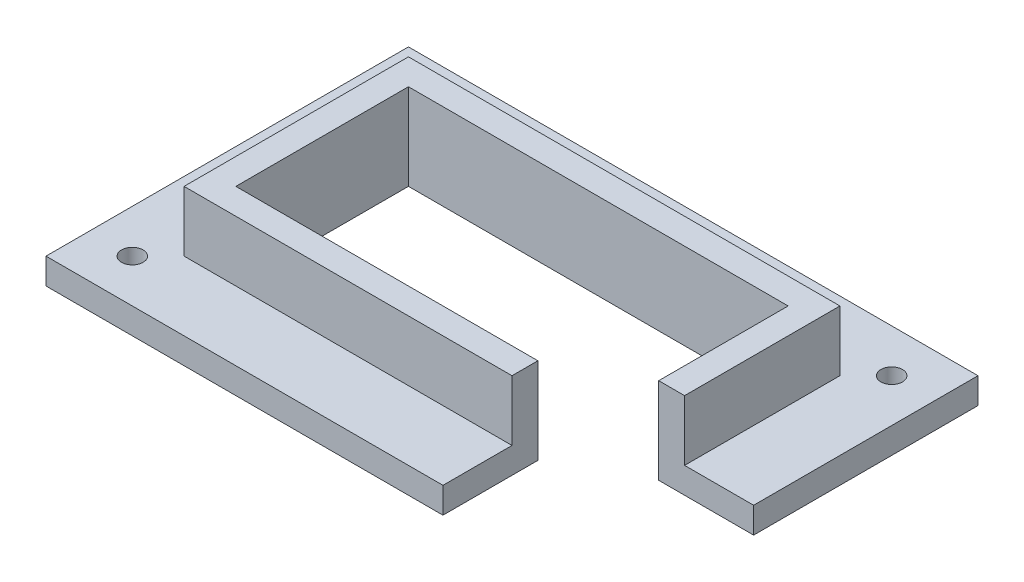
ISO-10303-21;
HEADER;
FILE_DESCRIPTION(('STEP AP214'),'2;1');
FILE_NAME('part.step','',(''),(''),'','','');
FILE_SCHEMA(('AUTOMOTIVE_DESIGN { 1 0 10303 214 1 1 1 1 }'));
ENDSEC;
DATA;
#1=APPLICATION_CONTEXT('core data for automotive mechanical design processes');
#2=APPLICATION_PROTOCOL_DEFINITION('international standard','automotive_design',2000,#1);
#3=PRODUCT_CONTEXT('',#1,'mechanical');
#4=PRODUCT('Part','Part','',(#3));
#5=PRODUCT_RELATED_PRODUCT_CATEGORY('part','',(#4));
#6=PRODUCT_DEFINITION_FORMATION('','',#4);
#7=PRODUCT_DEFINITION_CONTEXT('part definition',#1,'design');
#8=PRODUCT_DEFINITION('design','',#6,#7);
#9=PRODUCT_DEFINITION_SHAPE('','',#8);
#10=(LENGTH_UNIT() NAMED_UNIT(*) SI_UNIT(.MILLI.,.METRE.));
#11=(NAMED_UNIT(*) PLANE_ANGLE_UNIT() SI_UNIT($,.RADIAN.));
#12=(NAMED_UNIT(*) SI_UNIT($,.STERADIAN.) SOLID_ANGLE_UNIT());
#13=UNCERTAINTY_MEASURE_WITH_UNIT(LENGTH_MEASURE(1.E-05),#10,'distance_accuracy_value','');
#14=(GEOMETRIC_REPRESENTATION_CONTEXT(3) GLOBAL_UNCERTAINTY_ASSIGNED_CONTEXT((#13)) GLOBAL_UNIT_ASSIGNED_CONTEXT((#10,
#11,#12)) REPRESENTATION_CONTEXT('',''));
#15=CARTESIAN_POINT('',(0.,0.,0.));
#16=DIRECTION('',(0.,0.,1.));
#17=DIRECTION('',(1.,0.,0.));
#18=AXIS2_PLACEMENT_3D('',#15,#16,#17);
#19=CARTESIAN_POINT('',(0.,3.,0.));
#20=DIRECTION('',(0.,-1.,0.));
#21=DIRECTION('',(0.,0.,-1.));
#22=AXIS2_PLACEMENT_3D('',#19,#20,#21);
#23=PLANE('',#22);
#24=CARTESIAN_POINT('',(-28.,3.,16.));
#25=DIRECTION('',(0.,1.,0.));
#26=DIRECTION('',(0.,0.,1.));
#27=AXIS2_PLACEMENT_3D('',#24,#25,#26);
#28=CIRCLE('',#27,1.25);
#29=CARTESIAN_POINT('',(-28.,3.,17.25));
#30=VERTEX_POINT('',#29);
#31=EDGE_CURVE('E494',#30,#30,#28,.T.);
#32=ORIENTED_EDGE('',*,*,#31,.F.);
#33=EDGE_LOOP('',(#32));
#34=FACE_BOUND('',#33,.T.);
#35=CARTESIAN_POINT('',(-28.,3.,-16.));
#36=DIRECTION('',(0.,1.,0.));
#37=DIRECTION('',(0.,0.,1.));
#38=AXIS2_PLACEMENT_3D('',#35,#36,#37);
#39=CIRCLE('',#38,1.25);
#40=CARTESIAN_POINT('',(-28.,3.,-14.75));
#41=VERTEX_POINT('',#40);
#42=EDGE_CURVE('E501',#41,#41,#39,.T.);
#43=ORIENTED_EDGE('',*,*,#42,.F.);
#44=EDGE_LOOP('',(#43));
#45=FACE_BOUND('',#44,.T.);
#46=CARTESIAN_POINT('',(28.,3.,-16.));
#47=DIRECTION('',(0.,1.,0.));
#48=DIRECTION('',(0.,0.,1.));
#49=AXIS2_PLACEMENT_3D('',#46,#47,#48);
#50=CIRCLE('',#49,1.25);
#51=CARTESIAN_POINT('',(28.,3.,-14.75));
#52=VERTEX_POINT('',#51);
#53=EDGE_CURVE('E505',#52,#52,#50,.T.);
#54=ORIENTED_EDGE('',*,*,#53,.F.);
#55=EDGE_LOOP('',(#54));
#56=FACE_BOUND('',#55,.T.);
#57=DIRECTION('',(1.,0.,0.));
#58=VECTOR('',#57,1.);
#59=CARTESIAN_POINT('',(13.,3.,13.));
#60=LINE('',#59,#58);
#61=CARTESIAN_POINT('',(-25.,3.,13.));
#62=VERTEX_POINT('',#61);
#63=CARTESIAN_POINT('',(13.,3.,13.));
#64=VERTEX_POINT('',#63);
#65=EDGE_CURVE('E48',#62,#64,#60,.T.);
#66=ORIENTED_EDGE('',*,*,#65,.F.);
#67=DIRECTION('',(0.,0.,1.));
#68=VECTOR('',#67,1.);
#69=CARTESIAN_POINT('',(-25.,3.,13.));
#70=LINE('',#69,#68);
#71=CARTESIAN_POINT('',(-25.,3.,-13.));
#72=VERTEX_POINT('',#71);
#73=EDGE_CURVE('E52',#72,#62,#70,.T.);
#74=ORIENTED_EDGE('',*,*,#73,.F.);
#75=DIRECTION('',(-1.,0.,0.));
#76=VECTOR('',#75,1.);
#77=CARTESIAN_POINT('',(-25.,3.,-13.));
#78=LINE('',#77,#76);
#79=CARTESIAN_POINT('',(25.,3.,-13.));
#80=VERTEX_POINT('',#79);
#81=EDGE_CURVE('E189',#80,#72,#78,.T.);
#82=ORIENTED_EDGE('',*,*,#81,.F.);
#83=DIRECTION('',(0.,0.,-1.));
#84=VECTOR('',#83,1.);
#85=CARTESIAN_POINT('',(25.,3.,-13.));
#86=LINE('',#85,#84);
#87=CARTESIAN_POINT('',(25.,3.,5.));
#88=VERTEX_POINT('',#87);
#89=EDGE_CURVE('E186',#88,#80,#86,.T.);
#90=ORIENTED_EDGE('',*,*,#89,.F.);
#91=DIRECTION('',(1.,0.,0.));
#92=VECTOR('',#91,1.);
#93=CARTESIAN_POINT('',(22.,3.,5.));
#94=LINE('',#93,#92);
#95=CARTESIAN_POINT('',(33.,3.,4.99999999999999));
#96=VERTEX_POINT('',#95);
#97=EDGE_CURVE('E220',#88,#96,#94,.T.);
#98=ORIENTED_EDGE('',*,*,#97,.T.);
#99=DIRECTION('',(0.,0.,-1.));
#100=VECTOR('',#99,1.);
#101=CARTESIAN_POINT('',(33.,3.,4.99999999999999));
#102=LINE('',#101,#100);
#103=CARTESIAN_POINT('',(33.,3.,-21.));
#104=VERTEX_POINT('',#103);
#105=EDGE_CURVE('E208',#96,#104,#102,.T.);
#106=ORIENTED_EDGE('',*,*,#105,.T.);
#107=DIRECTION('',(-1.,0.,0.));
#108=VECTOR('',#107,1.);
#109=CARTESIAN_POINT('',(-33.,3.,-21.));
#110=LINE('',#109,#108);
#111=CARTESIAN_POINT('',(-33.,3.,-21.));
#112=VERTEX_POINT('',#111);
#113=EDGE_CURVE('E211',#104,#112,#110,.T.);
#114=ORIENTED_EDGE('',*,*,#113,.T.);
#115=DIRECTION('',(0.,0.,1.));
#116=VECTOR('',#115,1.);
#117=CARTESIAN_POINT('',(-33.,3.,21.));
#118=LINE('',#117,#116);
#119=CARTESIAN_POINT('',(-33.,3.,21.));
#120=VERTEX_POINT('',#119);
#121=EDGE_CURVE('E214',#112,#120,#118,.T.);
#122=ORIENTED_EDGE('',*,*,#121,.T.);
#123=DIRECTION('',(1.,0.,0.));
#124=VECTOR('',#123,1.);
#125=CARTESIAN_POINT('',(-33.,3.,21.));
#126=LINE('',#125,#124);
#127=CARTESIAN_POINT('',(13.,3.,21.));
#128=VERTEX_POINT('',#127);
#129=EDGE_CURVE('E216',#120,#128,#126,.T.);
#130=ORIENTED_EDGE('',*,*,#129,.T.);
#131=DIRECTION('',(0.,0.,-1.));
#132=VECTOR('',#131,1.);
#133=CARTESIAN_POINT('',(13.,3.,9.99999999999999));
#134=LINE('',#133,#132);
#135=EDGE_CURVE('E218',#128,#64,#134,.T.);
#136=ORIENTED_EDGE('',*,*,#135,.T.);
#137=EDGE_LOOP('',(#66,#74,#82,#90,#98,#106,#114,#122,#130,#136));
#138=FACE_BOUND('',#137,.T.);
#139=ADVANCED_FACE('F33',(#34,#45,#56,#138),#23,.F.);
#140=CARTESIAN_POINT('',(33.,3.,4.99999999999999));
#141=DIRECTION('',(-1.,0.,0.));
#142=DIRECTION('',(0.,0.,1.));
#143=AXIS2_PLACEMENT_3D('',#140,#141,#142);
#144=PLANE('',#143);
#145=DIRECTION('',(0.,0.,-1.));
#146=VECTOR('',#145,1.);
#147=CARTESIAN_POINT('',(33.,0.,4.99999999999999));
#148=LINE('',#147,#146);
#149=CARTESIAN_POINT('',(33.,0.,4.99999999999999));
#150=VERTEX_POINT('',#149);
#151=CARTESIAN_POINT('',(33.,0.,-21.));
#152=VERTEX_POINT('',#151);
#153=EDGE_CURVE('E207',#150,#152,#148,.T.);
#154=ORIENTED_EDGE('',*,*,#153,.T.);
#155=DIRECTION('',(0.,-1.,0.));
#156=VECTOR('',#155,1.);
#157=CARTESIAN_POINT('',(33.,3.,-21.));
#158=LINE('',#157,#156);
#159=EDGE_CURVE('E11',#104,#152,#158,.T.);
#160=ORIENTED_EDGE('',*,*,#159,.F.);
#161=ORIENTED_EDGE('',*,*,#105,.F.);
#162=DIRECTION('',(0.,-1.,0.));
#163=VECTOR('',#162,1.);
#164=CARTESIAN_POINT('',(33.,3.,4.99999999999999));
#165=LINE('',#164,#163);
#166=EDGE_CURVE('E222',#96,#150,#165,.T.);
#167=ORIENTED_EDGE('',*,*,#166,.T.);
#168=EDGE_LOOP('',(#154,#160,#161,#167));
#169=FACE_BOUND('',#168,.T.);
#170=ADVANCED_FACE('F35',(#169),#144,.F.);
#171=CARTESIAN_POINT('',(-33.,3.,-21.));
#172=DIRECTION('',(0.,0.,1.));
#173=DIRECTION('',(1.,0.,0.));
#174=AXIS2_PLACEMENT_3D('',#171,#172,#173);
#175=PLANE('',#174);
#176=DIRECTION('',(-1.,0.,0.));
#177=VECTOR('',#176,1.);
#178=CARTESIAN_POINT('',(-33.,0.,-21.));
#179=LINE('',#178,#177);
#180=CARTESIAN_POINT('',(-33.,0.,-21.));
#181=VERTEX_POINT('',#180);
#182=EDGE_CURVE('E225',#152,#181,#179,.T.);
#183=ORIENTED_EDGE('',*,*,#182,.T.);
#184=DIRECTION('',(0.,-1.,0.));
#185=VECTOR('',#184,1.);
#186=CARTESIAN_POINT('',(-33.,3.,-21.));
#187=LINE('',#186,#185);
#188=EDGE_CURVE('E41',#112,#181,#187,.T.);
#189=ORIENTED_EDGE('',*,*,#188,.F.);
#190=ORIENTED_EDGE('',*,*,#113,.F.);
#191=ORIENTED_EDGE('',*,*,#159,.T.);
#192=EDGE_LOOP('',(#183,#189,#190,#191));
#193=FACE_BOUND('',#192,.T.);
#194=ADVANCED_FACE('F301',(#193),#175,.F.);
#195=CARTESIAN_POINT('',(-33.,3.,21.));
#196=DIRECTION('',(1.,0.,0.));
#197=DIRECTION('',(0.,0.,-1.));
#198=AXIS2_PLACEMENT_3D('',#195,#196,#197);
#199=PLANE('',#198);
#200=DIRECTION('',(0.,0.,1.));
#201=VECTOR('',#200,1.);
#202=CARTESIAN_POINT('',(-33.,0.,21.));
#203=LINE('',#202,#201);
#204=CARTESIAN_POINT('',(-33.,0.,21.));
#205=VERTEX_POINT('',#204);
#206=EDGE_CURVE('E227',#181,#205,#203,.T.);
#207=ORIENTED_EDGE('',*,*,#206,.T.);
#208=DIRECTION('',(0.,-1.,0.));
#209=VECTOR('',#208,1.);
#210=CARTESIAN_POINT('',(-33.,3.,21.));
#211=LINE('',#210,#209);
#212=EDGE_CURVE('E254',#120,#205,#211,.T.);
#213=ORIENTED_EDGE('',*,*,#212,.F.);
#214=ORIENTED_EDGE('',*,*,#121,.F.);
#215=ORIENTED_EDGE('',*,*,#188,.T.);
#216=EDGE_LOOP('',(#207,#213,#214,#215));
#217=FACE_BOUND('',#216,.T.);
#218=ADVANCED_FACE('F261',(#217),#199,.F.);
#219=CARTESIAN_POINT('',(-33.,3.,21.));
#220=DIRECTION('',(0.,0.,-1.));
#221=DIRECTION('',(-1.,0.,0.));
#222=AXIS2_PLACEMENT_3D('',#219,#220,#221);
#223=PLANE('',#222);
#224=DIRECTION('',(1.,0.,0.));
#225=VECTOR('',#224,1.);
#226=CARTESIAN_POINT('',(-33.,0.,21.));
#227=LINE('',#226,#225);
#228=CARTESIAN_POINT('',(13.,0.,21.));
#229=VERTEX_POINT('',#228);
#230=EDGE_CURVE('E229',#205,#229,#227,.T.);
#231=ORIENTED_EDGE('',*,*,#230,.T.);
#232=DIRECTION('',(0.,-1.,0.));
#233=VECTOR('',#232,1.);
#234=CARTESIAN_POINT('',(13.,3.,21.));
#235=LINE('',#234,#233);
#236=EDGE_CURVE('E251',#128,#229,#235,.T.);
#237=ORIENTED_EDGE('',*,*,#236,.F.);
#238=ORIENTED_EDGE('',*,*,#129,.F.);
#239=ORIENTED_EDGE('',*,*,#212,.T.);
#240=EDGE_LOOP('',(#231,#237,#238,#239));
#241=FACE_BOUND('',#240,.T.);
#242=ADVANCED_FACE('F271',(#241),#223,.F.);
#243=CARTESIAN_POINT('',(13.,3.,9.99999999999999));
#244=DIRECTION('',(-1.,0.,0.));
#245=DIRECTION('',(0.,0.,1.));
#246=AXIS2_PLACEMENT_3D('',#243,#244,#245);
#247=PLANE('',#246);
#248=DIRECTION('',(0.,0.,-1.));
#249=VECTOR('',#248,1.);
#250=CARTESIAN_POINT('',(13.,0.,9.99999999999999));
#251=LINE('',#250,#249);
#252=CARTESIAN_POINT('',(13.,0.,9.99999999999999));
#253=VERTEX_POINT('',#252);
#254=EDGE_CURVE('E231',#229,#253,#251,.T.);
#255=ORIENTED_EDGE('',*,*,#254,.T.);
#256=DIRECTION('',(0.,-1.,0.));
#257=VECTOR('',#256,1.);
#258=CARTESIAN_POINT('',(13.,3.,9.99999999999999));
#259=LINE('',#258,#257);
#260=CARTESIAN_POINT('',(13.,10.,9.99999999999999));
#261=VERTEX_POINT('',#260);
#262=EDGE_CURVE('E148',#261,#253,#259,.T.);
#263=ORIENTED_EDGE('',*,*,#262,.F.);
#264=DIRECTION('',(0.,0.,-1.));
#265=VECTOR('',#264,1.);
#266=CARTESIAN_POINT('',(13.,10.,9.99999999999999));
#267=LINE('',#266,#265);
#268=CARTESIAN_POINT('',(13.,10.,13.));
#269=VERTEX_POINT('',#268);
#270=EDGE_CURVE('E163',#269,#261,#267,.T.);
#271=ORIENTED_EDGE('',*,*,#270,.F.);
#272=DIRECTION('',(0.,-1.,0.));
#273=VECTOR('',#272,1.);
#274=CARTESIAN_POINT('',(13.,10.,13.));
#275=LINE('',#274,#273);
#276=EDGE_CURVE('E185',#269,#64,#275,.T.);
#277=ORIENTED_EDGE('',*,*,#276,.T.);
#278=ORIENTED_EDGE('',*,*,#135,.F.);
#279=ORIENTED_EDGE('',*,*,#236,.T.);
#280=EDGE_LOOP('',(#255,#263,#271,#277,#278,#279));
#281=FACE_BOUND('',#280,.T.);
#282=ADVANCED_FACE('F275',(#281),#247,.F.);
#283=CARTESIAN_POINT('',(-22.,3.,9.99999999999999));
#284=DIRECTION('',(0.,0.,1.));
#285=DIRECTION('',(1.,0.,0.));
#286=AXIS2_PLACEMENT_3D('',#283,#284,#285);
#287=PLANE('',#286);
#288=DIRECTION('',(-1.,0.,0.));
#289=VECTOR('',#288,1.);
#290=CARTESIAN_POINT('',(-22.,0.,9.99999999999999));
#291=LINE('',#290,#289);
#292=CARTESIAN_POINT('',(-22.,0.,9.99999999999999));
#293=VERTEX_POINT('',#292);
#294=EDGE_CURVE('E145',#253,#293,#291,.T.);
#295=ORIENTED_EDGE('',*,*,#294,.T.);
#296=DIRECTION('',(0.,-1.,0.));
#297=VECTOR('',#296,1.);
#298=CARTESIAN_POINT('',(-22.,3.,9.99999999999999));
#299=LINE('',#298,#297);
#300=CARTESIAN_POINT('',(-22.,10.,9.99999999999999));
#301=VERTEX_POINT('',#300);
#302=EDGE_CURVE('E138',#301,#293,#299,.T.);
#303=ORIENTED_EDGE('',*,*,#302,.F.);
#304=DIRECTION('',(-1.,0.,0.));
#305=VECTOR('',#304,1.);
#306=CARTESIAN_POINT('',(-22.,10.,9.99999999999999));
#307=LINE('',#306,#305);
#308=EDGE_CURVE('E143',#261,#301,#307,.T.);
#309=ORIENTED_EDGE('',*,*,#308,.F.);
#310=ORIENTED_EDGE('',*,*,#262,.T.);
#311=EDGE_LOOP('',(#295,#303,#309,#310));
#312=FACE_BOUND('',#311,.T.);
#313=ADVANCED_FACE('F140',(#312),#287,.F.);
#314=CARTESIAN_POINT('',(-22.,3.,9.99999999999999));
#315=DIRECTION('',(-1.,0.,0.));
#316=DIRECTION('',(0.,0.,1.));
#317=AXIS2_PLACEMENT_3D('',#314,#315,#316);
#318=PLANE('',#317);
#319=DIRECTION('',(0.,0.,-1.));
#320=VECTOR('',#319,1.);
#321=CARTESIAN_POINT('',(-22.,0.,9.99999999999999));
#322=LINE('',#321,#320);
#323=CARTESIAN_POINT('',(-22.,0.,-10.));
#324=VERTEX_POINT('',#323);
#325=EDGE_CURVE('E234',#293,#324,#322,.T.);
#326=ORIENTED_EDGE('',*,*,#325,.T.);
#327=DIRECTION('',(0.,-1.,0.));
#328=VECTOR('',#327,1.);
#329=CARTESIAN_POINT('',(-22.,3.,-10.));
#330=LINE('',#329,#328);
#331=CARTESIAN_POINT('',(-22.,10.,-10.));
#332=VERTEX_POINT('',#331);
#333=EDGE_CURVE('E149',#332,#324,#330,.T.);
#334=ORIENTED_EDGE('',*,*,#333,.F.);
#335=DIRECTION('',(0.,0.,-1.));
#336=VECTOR('',#335,1.);
#337=CARTESIAN_POINT('',(-22.,10.,-10.));
#338=LINE('',#337,#336);
#339=EDGE_CURVE('E152',#301,#332,#338,.T.);
#340=ORIENTED_EDGE('',*,*,#339,.F.);
#341=ORIENTED_EDGE('',*,*,#302,.T.);
#342=EDGE_LOOP('',(#326,#334,#340,#341));
#343=FACE_BOUND('',#342,.T.);
#344=ADVANCED_FACE('F153',(#343),#318,.F.);
#345=CARTESIAN_POINT('',(-22.,3.,-10.));
#346=DIRECTION('',(0.,0.,-1.));
#347=DIRECTION('',(-1.,0.,0.));
#348=AXIS2_PLACEMENT_3D('',#345,#346,#347);
#349=PLANE('',#348);
#350=DIRECTION('',(1.,0.,0.));
#351=VECTOR('',#350,1.);
#352=CARTESIAN_POINT('',(-22.,0.,-10.));
#353=LINE('',#352,#351);
#354=CARTESIAN_POINT('',(22.,0.,-10.));
#355=VERTEX_POINT('',#354);
#356=EDGE_CURVE('E236',#324,#355,#353,.T.);
#357=ORIENTED_EDGE('',*,*,#356,.T.);
#358=DIRECTION('',(0.,-1.,0.));
#359=VECTOR('',#358,1.);
#360=CARTESIAN_POINT('',(22.,3.,-10.));
#361=LINE('',#360,#359);
#362=CARTESIAN_POINT('',(22.,10.,-10.));
#363=VERTEX_POINT('',#362);
#364=EDGE_CURVE('E246',#363,#355,#361,.T.);
#365=ORIENTED_EDGE('',*,*,#364,.F.);
#366=DIRECTION('',(1.,0.,0.));
#367=VECTOR('',#366,1.);
#368=CARTESIAN_POINT('',(22.,10.,-10.));
#369=LINE('',#368,#367);
#370=EDGE_CURVE('E158',#332,#363,#369,.T.);
#371=ORIENTED_EDGE('',*,*,#370,.F.);
#372=ORIENTED_EDGE('',*,*,#333,.T.);
#373=EDGE_LOOP('',(#357,#365,#371,#372));
#374=FACE_BOUND('',#373,.T.);
#375=ADVANCED_FACE('F326',(#374),#349,.F.);
#376=CARTESIAN_POINT('',(22.,3.,-10.));
#377=DIRECTION('',(1.,0.,0.));
#378=DIRECTION('',(0.,0.,-1.));
#379=AXIS2_PLACEMENT_3D('',#376,#377,#378);
#380=PLANE('',#379);
#381=DIRECTION('',(0.,0.,1.));
#382=VECTOR('',#381,1.);
#383=CARTESIAN_POINT('',(22.,0.,-10.));
#384=LINE('',#383,#382);
#385=CARTESIAN_POINT('',(22.,0.,5.));
#386=VERTEX_POINT('',#385);
#387=EDGE_CURVE('E238',#355,#386,#384,.T.);
#388=ORIENTED_EDGE('',*,*,#387,.T.);
#389=DIRECTION('',(0.,-1.,0.));
#390=VECTOR('',#389,1.);
#391=CARTESIAN_POINT('',(22.,3.,5.));
#392=LINE('',#391,#390);
#393=CARTESIAN_POINT('',(22.,10.,5.));
#394=VERTEX_POINT('',#393);
#395=EDGE_CURVE('E243',#394,#386,#392,.T.);
#396=ORIENTED_EDGE('',*,*,#395,.F.);
#397=DIRECTION('',(0.,0.,1.));
#398=VECTOR('',#397,1.);
#399=CARTESIAN_POINT('',(22.,10.,5.));
#400=LINE('',#399,#398);
#401=EDGE_CURVE('E171',#363,#394,#400,.T.);
#402=ORIENTED_EDGE('',*,*,#401,.F.);
#403=ORIENTED_EDGE('',*,*,#364,.T.);
#404=EDGE_LOOP('',(#388,#396,#402,#403));
#405=FACE_BOUND('',#404,.T.);
#406=ADVANCED_FACE('F323',(#405),#380,.F.);
#407=CARTESIAN_POINT('',(22.,3.,5.));
#408=DIRECTION('',(0.,0.,-1.));
#409=DIRECTION('',(-1.,0.,0.));
#410=AXIS2_PLACEMENT_3D('',#407,#408,#409);
#411=PLANE('',#410);
#412=DIRECTION('',(1.,0.,0.));
#413=VECTOR('',#412,1.);
#414=CARTESIAN_POINT('',(22.,0.,5.));
#415=LINE('',#414,#413);
#416=EDGE_CURVE('E212',#386,#150,#415,.T.);
#417=ORIENTED_EDGE('',*,*,#416,.T.);
#418=ORIENTED_EDGE('',*,*,#166,.F.);
#419=ORIENTED_EDGE('',*,*,#97,.F.);
#420=DIRECTION('',(0.,-1.,0.));
#421=VECTOR('',#420,1.);
#422=CARTESIAN_POINT('',(25.,10.,5.));
#423=LINE('',#422,#421);
#424=CARTESIAN_POINT('',(25.,10.,5.));
#425=VERTEX_POINT('',#424);
#426=EDGE_CURVE('E204',#425,#88,#423,.T.);
#427=ORIENTED_EDGE('',*,*,#426,.F.);
#428=DIRECTION('',(1.,0.,0.));
#429=VECTOR('',#428,1.);
#430=CARTESIAN_POINT('',(25.,10.,5.));
#431=LINE('',#430,#429);
#432=EDGE_CURVE('E174',#394,#425,#431,.T.);
#433=ORIENTED_EDGE('',*,*,#432,.F.);
#434=ORIENTED_EDGE('',*,*,#395,.T.);
#435=EDGE_LOOP('',(#417,#418,#419,#427,#433,#434));
#436=FACE_BOUND('',#435,.T.);
#437=ADVANCED_FACE('F296',(#436),#411,.F.);
#438=CARTESIAN_POINT('',(0.,0.,0.));
#439=DIRECTION('',(0.,-1.,0.));
#440=DIRECTION('',(0.,0.,-1.));
#441=AXIS2_PLACEMENT_3D('',#438,#439,#440);
#442=PLANE('',#441);
#443=CARTESIAN_POINT('',(-28.,0.,16.));
#444=DIRECTION('',(0.,-1.,0.));
#445=DIRECTION('',(0.,0.,-1.));
#446=AXIS2_PLACEMENT_3D('',#443,#444,#445);
#447=CIRCLE('',#446,1.25);
#448=CARTESIAN_POINT('',(-28.,0.,14.75));
#449=VERTEX_POINT('',#448);
#450=EDGE_CURVE('E190',#449,#449,#447,.F.);
#451=ORIENTED_EDGE('',*,*,#450,.T.);
#452=EDGE_LOOP('',(#451));
#453=FACE_BOUND('',#452,.T.);
#454=CARTESIAN_POINT('',(-28.,0.,-16.));
#455=DIRECTION('',(0.,-1.,0.));
#456=DIRECTION('',(0.,0.,-1.));
#457=AXIS2_PLACEMENT_3D('',#454,#455,#456);
#458=CIRCLE('',#457,1.25);
#459=CARTESIAN_POINT('',(-28.,0.,-17.25));
#460=VERTEX_POINT('',#459);
#461=EDGE_CURVE('E498',#460,#460,#458,.F.);
#462=ORIENTED_EDGE('',*,*,#461,.T.);
#463=EDGE_LOOP('',(#462));
#464=FACE_BOUND('',#463,.T.);
#465=CARTESIAN_POINT('',(28.,0.,-16.));
#466=DIRECTION('',(0.,-1.,0.));
#467=DIRECTION('',(0.,0.,-1.));
#468=AXIS2_PLACEMENT_3D('',#465,#466,#467);
#469=CIRCLE('',#468,1.25);
#470=CARTESIAN_POINT('',(28.,0.,-17.25));
#471=VERTEX_POINT('',#470);
#472=EDGE_CURVE('E167',#471,#471,#469,.F.);
#473=ORIENTED_EDGE('',*,*,#472,.T.);
#474=EDGE_LOOP('',(#473));
#475=FACE_BOUND('',#474,.T.);
#476=ORIENTED_EDGE('',*,*,#153,.F.);
#477=ORIENTED_EDGE('',*,*,#416,.F.);
#478=ORIENTED_EDGE('',*,*,#387,.F.);
#479=ORIENTED_EDGE('',*,*,#356,.F.);
#480=ORIENTED_EDGE('',*,*,#325,.F.);
#481=ORIENTED_EDGE('',*,*,#294,.F.);
#482=ORIENTED_EDGE('',*,*,#254,.F.);
#483=ORIENTED_EDGE('',*,*,#230,.F.);
#484=ORIENTED_EDGE('',*,*,#206,.F.);
#485=ORIENTED_EDGE('',*,*,#182,.F.);
#486=EDGE_LOOP('',(#476,#477,#478,#479,#480,#481,#482,#483,#484,#485));
#487=FACE_BOUND('',#486,.T.);
#488=ADVANCED_FACE('F267',(#453,#464,#475,#487),#442,.T.);
#489=CARTESIAN_POINT('',(25.,10.,-13.));
#490=DIRECTION('',(-1.,0.,0.));
#491=DIRECTION('',(0.,0.,1.));
#492=AXIS2_PLACEMENT_3D('',#489,#490,#491);
#493=PLANE('',#492);
#494=ORIENTED_EDGE('',*,*,#89,.T.);
#495=DIRECTION('',(0.,-1.,0.));
#496=VECTOR('',#495,1.);
#497=CARTESIAN_POINT('',(25.,10.,-13.));
#498=LINE('',#497,#496);
#499=CARTESIAN_POINT('',(25.,10.,-13.));
#500=VERTEX_POINT('',#499);
#501=EDGE_CURVE('E201',#500,#80,#498,.T.);
#502=ORIENTED_EDGE('',*,*,#501,.F.);
#503=DIRECTION('',(0.,0.,-1.));
#504=VECTOR('',#503,1.);
#505=CARTESIAN_POINT('',(25.,10.,-13.));
#506=LINE('',#505,#504);
#507=EDGE_CURVE('E176',#425,#500,#506,.T.);
#508=ORIENTED_EDGE('',*,*,#507,.F.);
#509=ORIENTED_EDGE('',*,*,#426,.T.);
#510=EDGE_LOOP('',(#494,#502,#508,#509));
#511=FACE_BOUND('',#510,.T.);
#512=ADVANCED_FACE('F291',(#511),#493,.F.);
#513=CARTESIAN_POINT('',(-25.,10.,-13.));
#514=DIRECTION('',(0.,0.,1.));
#515=DIRECTION('',(1.,0.,0.));
#516=AXIS2_PLACEMENT_3D('',#513,#514,#515);
#517=PLANE('',#516);
#518=ORIENTED_EDGE('',*,*,#81,.T.);
#519=DIRECTION('',(0.,-1.,0.));
#520=VECTOR('',#519,1.);
#521=CARTESIAN_POINT('',(-25.,10.,-13.));
#522=LINE('',#521,#520);
#523=CARTESIAN_POINT('',(-25.,10.,-13.));
#524=VERTEX_POINT('',#523);
#525=EDGE_CURVE('E198',#524,#72,#522,.T.);
#526=ORIENTED_EDGE('',*,*,#525,.F.);
#527=DIRECTION('',(-1.,0.,0.));
#528=VECTOR('',#527,1.);
#529=CARTESIAN_POINT('',(-25.,10.,-13.));
#530=LINE('',#529,#528);
#531=EDGE_CURVE('E178',#500,#524,#530,.T.);
#532=ORIENTED_EDGE('',*,*,#531,.F.);
#533=ORIENTED_EDGE('',*,*,#501,.T.);
#534=EDGE_LOOP('',(#518,#526,#532,#533));
#535=FACE_BOUND('',#534,.T.);
#536=ADVANCED_FACE('F287',(#535),#517,.F.);
#537=CARTESIAN_POINT('',(-25.,10.,13.));
#538=DIRECTION('',(1.,0.,0.));
#539=DIRECTION('',(0.,0.,-1.));
#540=AXIS2_PLACEMENT_3D('',#537,#538,#539);
#541=PLANE('',#540);
#542=ORIENTED_EDGE('',*,*,#73,.T.);
#543=DIRECTION('',(0.,-1.,0.));
#544=VECTOR('',#543,1.);
#545=CARTESIAN_POINT('',(-25.,10.,13.));
#546=LINE('',#545,#544);
#547=CARTESIAN_POINT('',(-25.,10.,13.));
#548=VERTEX_POINT('',#547);
#549=EDGE_CURVE('E195',#548,#62,#546,.T.);
#550=ORIENTED_EDGE('',*,*,#549,.F.);
#551=DIRECTION('',(0.,0.,1.));
#552=VECTOR('',#551,1.);
#553=CARTESIAN_POINT('',(-25.,10.,13.));
#554=LINE('',#553,#552);
#555=EDGE_CURVE('E180',#524,#548,#554,.T.);
#556=ORIENTED_EDGE('',*,*,#555,.F.);
#557=ORIENTED_EDGE('',*,*,#525,.T.);
#558=EDGE_LOOP('',(#542,#550,#556,#557));
#559=FACE_BOUND('',#558,.T.);
#560=ADVANCED_FACE('F283',(#559),#541,.F.);
#561=CARTESIAN_POINT('',(13.,10.,13.));
#562=DIRECTION('',(0.,0.,-1.));
#563=DIRECTION('',(-1.,0.,0.));
#564=AXIS2_PLACEMENT_3D('',#561,#562,#563);
#565=PLANE('',#564);
#566=ORIENTED_EDGE('',*,*,#65,.T.);
#567=ORIENTED_EDGE('',*,*,#276,.F.);
#568=DIRECTION('',(1.,0.,0.));
#569=VECTOR('',#568,1.);
#570=CARTESIAN_POINT('',(13.,10.,13.));
#571=LINE('',#570,#569);
#572=EDGE_CURVE('E182',#548,#269,#571,.T.);
#573=ORIENTED_EDGE('',*,*,#572,.F.);
#574=ORIENTED_EDGE('',*,*,#549,.T.);
#575=EDGE_LOOP('',(#566,#567,#573,#574));
#576=FACE_BOUND('',#575,.T.);
#577=ADVANCED_FACE('F278',(#576),#565,.F.);
#578=CARTESIAN_POINT('',(0.,10.,0.));
#579=DIRECTION('',(0.,-1.,0.));
#580=DIRECTION('',(0.,0.,-1.));
#581=AXIS2_PLACEMENT_3D('',#578,#579,#580);
#582=PLANE('',#581);
#583=ORIENTED_EDGE('',*,*,#308,.T.);
#584=ORIENTED_EDGE('',*,*,#339,.T.);
#585=ORIENTED_EDGE('',*,*,#370,.T.);
#586=ORIENTED_EDGE('',*,*,#401,.T.);
#587=ORIENTED_EDGE('',*,*,#432,.T.);
#588=ORIENTED_EDGE('',*,*,#507,.T.);
#589=ORIENTED_EDGE('',*,*,#531,.T.);
#590=ORIENTED_EDGE('',*,*,#555,.T.);
#591=ORIENTED_EDGE('',*,*,#572,.T.);
#592=ORIENTED_EDGE('',*,*,#270,.T.);
#593=EDGE_LOOP('',(#583,#584,#585,#586,#587,#588,#589,#590,#591,#592));
#594=FACE_BOUND('',#593,.T.);
#595=ADVANCED_FACE('F161',(#594),#582,.F.);
#596=CARTESIAN_POINT('',(28.,-3.53553390593275,-16.));
#597=DIRECTION('',(0.,1.,0.));
#598=DIRECTION('',(0.,0.,1.));
#599=AXIS2_PLACEMENT_3D('',#596,#597,#598);
#600=CYLINDRICAL_SURFACE('',#599,1.25);
#601=ORIENTED_EDGE('',*,*,#53,.T.);
#602=EDGE_LOOP('',(#601));
#603=FACE_BOUND('',#602,.T.);
#604=ORIENTED_EDGE('',*,*,#472,.F.);
#605=EDGE_LOOP('',(#604));
#606=FACE_BOUND('',#605,.T.);
#607=ADVANCED_FACE('F399',(#603,#606),#600,.F.);
#608=CARTESIAN_POINT('',(-28.,-3.53553390593275,-16.));
#609=DIRECTION('',(0.,1.,0.));
#610=DIRECTION('',(0.,0.,1.));
#611=AXIS2_PLACEMENT_3D('',#608,#609,#610);
#612=CYLINDRICAL_SURFACE('',#611,1.25);
#613=ORIENTED_EDGE('',*,*,#42,.T.);
#614=EDGE_LOOP('',(#613));
#615=FACE_BOUND('',#614,.T.);
#616=ORIENTED_EDGE('',*,*,#461,.F.);
#617=EDGE_LOOP('',(#616));
#618=FACE_BOUND('',#617,.T.);
#619=ADVANCED_FACE('F405',(#615,#618),#612,.F.);
#620=CARTESIAN_POINT('',(-28.,-3.53553390593275,16.));
#621=DIRECTION('',(0.,1.,0.));
#622=DIRECTION('',(0.,0.,1.));
#623=AXIS2_PLACEMENT_3D('',#620,#621,#622);
#624=CYLINDRICAL_SURFACE('',#623,1.25);
#625=ORIENTED_EDGE('',*,*,#31,.T.);
#626=EDGE_LOOP('',(#625));
#627=FACE_BOUND('',#626,.T.);
#628=ORIENTED_EDGE('',*,*,#450,.F.);
#629=EDGE_LOOP('',(#628));
#630=FACE_BOUND('',#629,.T.);
#631=ADVANCED_FACE('F413',(#627,#630),#624,.F.);
#632=CLOSED_SHELL('',(#139,#170,#194,#218,#242,#282,#313,#344,#375,#406,#437,#488,#512,#536,
#560,#577,#595,#607,#619,#631));
#633=MANIFOLD_SOLID_BREP('B2',#632);
#634=ADVANCED_BREP_SHAPE_REPRESENTATION('',(#18,#633),#14);
#635=SHAPE_DEFINITION_REPRESENTATION(#9,#634);
ENDSEC;
END-ISO-10303-21;
